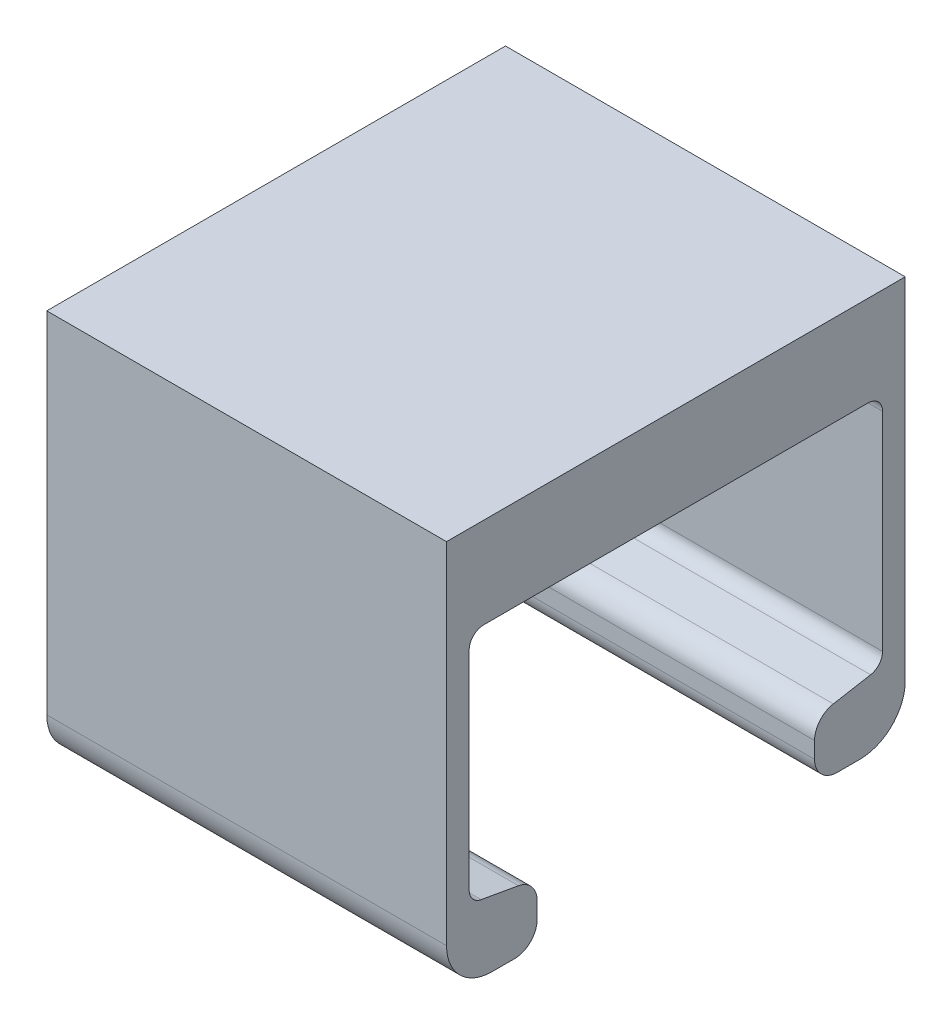
ISO-10303-21;
HEADER;
FILE_DESCRIPTION(('STEP AP214'),'2;1');
FILE_NAME('part.step','',(''),(''),'','','');
FILE_SCHEMA(('AUTOMOTIVE_DESIGN { 1 0 10303 214 1 1 1 1 }'));
ENDSEC;
DATA;
#1=APPLICATION_CONTEXT('core data for automotive mechanical design processes');
#2=APPLICATION_PROTOCOL_DEFINITION('international standard','automotive_design',2000,#1);
#3=PRODUCT_CONTEXT('',#1,'mechanical');
#4=PRODUCT('Part','Part','',(#3));
#5=PRODUCT_RELATED_PRODUCT_CATEGORY('part','',(#4));
#6=PRODUCT_DEFINITION_FORMATION('','',#4);
#7=PRODUCT_DEFINITION_CONTEXT('part definition',#1,'design');
#8=PRODUCT_DEFINITION('design','',#6,#7);
#9=PRODUCT_DEFINITION_SHAPE('','',#8);
#10=(LENGTH_UNIT() NAMED_UNIT(*) SI_UNIT(.MILLI.,.METRE.));
#11=(NAMED_UNIT(*) PLANE_ANGLE_UNIT() SI_UNIT($,.RADIAN.));
#12=(NAMED_UNIT(*) SI_UNIT($,.STERADIAN.) SOLID_ANGLE_UNIT());
#13=UNCERTAINTY_MEASURE_WITH_UNIT(LENGTH_MEASURE(1.E-05),#10,'distance_accuracy_value','');
#14=(GEOMETRIC_REPRESENTATION_CONTEXT(3) GLOBAL_UNCERTAINTY_ASSIGNED_CONTEXT((#13)) GLOBAL_UNIT_ASSIGNED_CONTEXT((#10,
#11,#12)) REPRESENTATION_CONTEXT('',''));
#15=CARTESIAN_POINT('',(0.,0.,0.));
#16=DIRECTION('',(0.,0.,1.));
#17=DIRECTION('',(1.,0.,0.));
#18=AXIS2_PLACEMENT_3D('',#15,#16,#17);
#19=CARTESIAN_POINT('',(14.,-6.26381577100157,-9.7155));
#20=DIRECTION('',(0.,-0.984807753012208,-0.173648177666931));
#21=DIRECTION('',(0.,0.173648177666931,-0.984807753012208));
#22=AXIS2_PLACEMENT_3D('',#19,#20,#21);
#23=PLANE('',#22);
#24=DIRECTION('',(0.,-0.173648177666931,0.984807753012208));
#25=VECTOR('',#24,1.);
#26=CARTESIAN_POINT('',(-14.,-6.26381577100157,-9.7155));
#27=LINE('',#26,#25);
#28=CARTESIAN_POINT('',(-14.,-5.57209797716179,-13.6384265485096));
#29=VERTEX_POINT('',#28);
#30=CARTESIAN_POINT('',(-14.,-6.03250412758862,-11.0273335179537));
#31=VERTEX_POINT('',#30);
#32=EDGE_CURVE('E389',#29,#31,#27,.T.);
#33=ORIENTED_EDGE('',*,*,#32,.T.);
#34=DIRECTION('',(-1.,0.,0.));
#35=VECTOR('',#34,1.);
#36=CARTESIAN_POINT('',(14.,-6.03250412758862,-11.0273335179537));
#37=LINE('',#36,#35);
#38=CARTESIAN_POINT('',(14.,-6.03250412758862,-11.0273335179537));
#39=VERTEX_POINT('',#38);
#40=EDGE_CURVE('E11',#31,#39,#37,.F.);
#41=ORIENTED_EDGE('',*,*,#40,.T.);
#42=DIRECTION('',(0.,-0.173648177666931,0.984807753012208));
#43=VECTOR('',#42,1.);
#44=CARTESIAN_POINT('',(14.,-6.26381577100157,-9.7155));
#45=LINE('',#44,#43);
#46=CARTESIAN_POINT('',(14.,-5.57209797716179,-13.6384265485096));
#47=VERTEX_POINT('',#46);
#48=EDGE_CURVE('E234',#47,#39,#45,.T.);
#49=ORIENTED_EDGE('',*,*,#48,.F.);
#50=DIRECTION('',(-1.,0.,0.));
#51=VECTOR('',#50,1.);
#52=CARTESIAN_POINT('',(-14.,-5.57209797716179,-13.6384265485096));
#53=LINE('',#52,#51);
#54=EDGE_CURVE('E288',#47,#29,#53,.T.);
#55=ORIENTED_EDGE('',*,*,#54,.T.);
#56=EDGE_LOOP('',(#33,#41,#49,#55));
#57=FACE_BOUND('',#56,.T.);
#58=ADVANCED_FACE('F35',(#57),#23,.F.);
#59=CARTESIAN_POINT('',(14.,-6.26381577100157,-9.7155));
#60=DIRECTION('',(0.,0.,-1.));
#61=DIRECTION('',(-1.,0.,0.));
#62=AXIS2_PLACEMENT_3D('',#59,#60,#61);
#63=PLANE('',#62);
#64=DIRECTION('',(0.,-1.,0.));
#65=VECTOR('',#64,1.);
#66=CARTESIAN_POINT('',(-14.,-6.26381577100157,-9.7155));
#67=LINE('',#66,#65);
#68=CARTESIAN_POINT('',(-14.,-7.5958864354955,-9.7155));
#69=VERTEX_POINT('',#68);
#70=CARTESIAN_POINT('',(-14.,-8.73784842210571,-9.7155));
#71=VERTEX_POINT('',#70);
#72=EDGE_CURVE('E391',#69,#71,#67,.T.);
#73=ORIENTED_EDGE('',*,*,#72,.T.);
#74=DIRECTION('',(-1.,0.,0.));
#75=VECTOR('',#74,1.);
#76=CARTESIAN_POINT('',(14.,-8.73784842210571,-9.7155));
#77=LINE('',#76,#75);
#78=CARTESIAN_POINT('',(14.,-8.73784842210571,-9.7155));
#79=VERTEX_POINT('',#78);
#80=EDGE_CURVE('E332',#71,#79,#77,.F.);
#81=ORIENTED_EDGE('',*,*,#80,.T.);
#82=DIRECTION('',(0.,-1.,0.));
#83=VECTOR('',#82,1.);
#84=CARTESIAN_POINT('',(14.,-6.26381577100157,-9.7155));
#85=LINE('',#84,#83);
#86=CARTESIAN_POINT('',(14.,-7.5958864354955,-9.7155));
#87=VERTEX_POINT('',#86);
#88=EDGE_CURVE('E236',#87,#79,#85,.T.);
#89=ORIENTED_EDGE('',*,*,#88,.F.);
#90=DIRECTION('',(-1.,0.,0.));
#91=VECTOR('',#90,1.);
#92=CARTESIAN_POINT('',(14.,-7.5958864354955,-9.7155));
#93=LINE('',#92,#91);
#94=EDGE_CURVE('E329',#87,#69,#93,.T.);
#95=ORIENTED_EDGE('',*,*,#94,.T.);
#96=EDGE_LOOP('',(#73,#81,#89,#95));
#97=FACE_BOUND('',#96,.T.);
#98=ADVANCED_FACE('F413',(#97),#63,.F.);
#99=CARTESIAN_POINT('',(14.,-10.3253484221057,-16.0655));
#100=DIRECTION('',(0.,1.,0.));
#101=DIRECTION('',(0.,0.,1.));
#102=AXIS2_PLACEMENT_3D('',#99,#100,#101);
#103=PLANE('',#102);
#104=DIRECTION('',(0.,0.,-1.));
#105=VECTOR('',#104,1.);
#106=CARTESIAN_POINT('',(14.,-10.3253484221057,-16.0655));
#107=LINE('',#106,#105);
#108=CARTESIAN_POINT('',(14.,-10.3253484221057,-11.303));
#109=VERTEX_POINT('',#108);
#110=CARTESIAN_POINT('',(14.,-10.3253484221057,-12.8905));
#111=VERTEX_POINT('',#110);
#112=EDGE_CURVE('E239',#109,#111,#107,.T.);
#113=ORIENTED_EDGE('',*,*,#112,.F.);
#114=DIRECTION('',(-1.,0.,0.));
#115=VECTOR('',#114,1.);
#116=CARTESIAN_POINT('',(14.,-10.3253484221057,-11.303));
#117=LINE('',#116,#115);
#118=CARTESIAN_POINT('',(-14.,-10.3253484221057,-11.303));
#119=VERTEX_POINT('',#118);
#120=EDGE_CURVE('E318',#109,#119,#117,.T.);
#121=ORIENTED_EDGE('',*,*,#120,.T.);
#122=DIRECTION('',(0.,0.,-1.));
#123=VECTOR('',#122,1.);
#124=CARTESIAN_POINT('',(-14.,-10.3253484221057,-16.0655));
#125=LINE('',#124,#123);
#126=CARTESIAN_POINT('',(-14.,-10.3253484221057,-12.8905));
#127=VERTEX_POINT('',#126);
#128=EDGE_CURVE('E198',#119,#127,#125,.T.);
#129=ORIENTED_EDGE('',*,*,#128,.T.);
#130=DIRECTION('',(-1.,0.,0.));
#131=VECTOR('',#130,1.);
#132=CARTESIAN_POINT('',(14.,-10.3253484221057,-12.8905));
#133=LINE('',#132,#131);
#134=EDGE_CURVE('E277',#127,#111,#133,.F.);
#135=ORIENTED_EDGE('',*,*,#134,.T.);
#136=EDGE_LOOP('',(#113,#121,#129,#135));
#137=FACE_BOUND('',#136,.T.);
#138=ADVANCED_FACE('F402',(#137),#103,.F.);
#139=CARTESIAN_POINT('',(14.,17.358,-16.0655));
#140=DIRECTION('',(0.,0.,1.));
#141=DIRECTION('',(0.,-1.,0.));
#142=AXIS2_PLACEMENT_3D('',#139,#140,#141);
#143=PLANE('',#142);
#144=DIRECTION('',(0.,1.,0.));
#145=VECTOR('',#144,1.);
#146=CARTESIAN_POINT('',(14.,17.358,-16.0655));
#147=LINE('',#146,#145);
#148=CARTESIAN_POINT('',(14.,-7.15034842210571,-16.0655));
#149=VERTEX_POINT('',#148);
#150=CARTESIAN_POINT('',(14.,17.358,-16.0655));
#151=VERTEX_POINT('',#150);
#152=EDGE_CURVE('E241',#149,#151,#147,.T.);
#153=ORIENTED_EDGE('',*,*,#152,.F.);
#154=DIRECTION('',(-1.,0.,0.));
#155=VECTOR('',#154,1.);
#156=CARTESIAN_POINT('',(14.,-7.15034842210572,-16.0655));
#157=LINE('',#156,#155);
#158=CARTESIAN_POINT('',(-14.,-7.15034842210571,-16.0655));
#159=VERTEX_POINT('',#158);
#160=EDGE_CURVE('E193',#149,#159,#157,.T.);
#161=ORIENTED_EDGE('',*,*,#160,.T.);
#162=DIRECTION('',(0.,1.,0.));
#163=VECTOR('',#162,1.);
#164=CARTESIAN_POINT('',(-14.,17.358,-16.0655));
#165=LINE('',#164,#163);
#166=CARTESIAN_POINT('',(-14.,17.358,-16.0655));
#167=VERTEX_POINT('',#166);
#168=EDGE_CURVE('E186',#159,#167,#165,.T.);
#169=ORIENTED_EDGE('',*,*,#168,.T.);
#170=DIRECTION('',(-1.,0.,0.));
#171=VECTOR('',#170,1.);
#172=CARTESIAN_POINT('',(14.,17.358,-16.0655));
#173=LINE('',#172,#171);
#174=EDGE_CURVE('E190',#151,#167,#173,.T.);
#175=ORIENTED_EDGE('',*,*,#174,.F.);
#176=EDGE_LOOP('',(#153,#161,#169,#175));
#177=FACE_BOUND('',#176,.T.);
#178=ADVANCED_FACE('F189',(#177),#143,.F.);
#179=CARTESIAN_POINT('',(14.,17.358,0.));
#180=DIRECTION('',(0.,-1.,0.));
#181=DIRECTION('',(0.,0.,-1.));
#182=AXIS2_PLACEMENT_3D('',#179,#180,#181);
#183=PLANE('',#182);
#184=ORIENTED_EDGE('',*,*,#174,.T.);
#185=DIRECTION('',(0.,0.,1.));
#186=VECTOR('',#185,1.);
#187=CARTESIAN_POINT('',(-14.,17.358,0.));
#188=LINE('',#187,#186);
#189=CARTESIAN_POINT('',(-14.,17.358,16.0655));
#190=VERTEX_POINT('',#189);
#191=EDGE_CURVE('E197',#167,#190,#188,.T.);
#192=ORIENTED_EDGE('',*,*,#191,.T.);
#193=DIRECTION('',(-1.,0.,0.));
#194=VECTOR('',#193,1.);
#195=CARTESIAN_POINT('',(14.,17.358,16.0655));
#196=LINE('',#195,#194);
#197=CARTESIAN_POINT('',(14.,17.358,16.0655));
#198=VERTEX_POINT('',#197);
#199=EDGE_CURVE('E207',#198,#190,#196,.T.);
#200=ORIENTED_EDGE('',*,*,#199,.F.);
#201=DIRECTION('',(0.,0.,1.));
#202=VECTOR('',#201,1.);
#203=CARTESIAN_POINT('',(14.,17.358,0.));
#204=LINE('',#203,#202);
#205=EDGE_CURVE('E205',#151,#198,#204,.T.);
#206=ORIENTED_EDGE('',*,*,#205,.F.);
#207=EDGE_LOOP('',(#184,#192,#200,#206));
#208=FACE_BOUND('',#207,.T.);
#209=ADVANCED_FACE('F202',(#208),#183,.F.);
#210=CARTESIAN_POINT('',(14.,17.358,16.0655));
#211=DIRECTION('',(0.,0.,-1.));
#212=DIRECTION('',(0.,1.,0.));
#213=AXIS2_PLACEMENT_3D('',#210,#211,#212);
#214=PLANE('',#213);
#215=DIRECTION('',(0.,-1.,0.));
#216=VECTOR('',#215,1.);
#217=CARTESIAN_POINT('',(-14.,17.358,16.0655));
#218=LINE('',#217,#216);
#219=CARTESIAN_POINT('',(-14.,-7.15034842210571,16.0655));
#220=VERTEX_POINT('',#219);
#221=EDGE_CURVE('E212',#190,#220,#218,.T.);
#222=ORIENTED_EDGE('',*,*,#221,.T.);
#223=DIRECTION('',(-1.,0.,0.));
#224=VECTOR('',#223,1.);
#225=CARTESIAN_POINT('',(14.,-7.15034842210572,16.0655));
#226=LINE('',#225,#224);
#227=CARTESIAN_POINT('',(14.,-7.15034842210571,16.0655));
#228=VERTEX_POINT('',#227);
#229=EDGE_CURVE('E270',#220,#228,#226,.F.);
#230=ORIENTED_EDGE('',*,*,#229,.T.);
#231=DIRECTION('',(0.,-1.,0.));
#232=VECTOR('',#231,1.);
#233=CARTESIAN_POINT('',(14.,17.358,16.0655));
#234=LINE('',#233,#232);
#235=EDGE_CURVE('E244',#198,#228,#234,.T.);
#236=ORIENTED_EDGE('',*,*,#235,.F.);
#237=ORIENTED_EDGE('',*,*,#199,.T.);
#238=EDGE_LOOP('',(#222,#230,#236,#237));
#239=FACE_BOUND('',#238,.T.);
#240=ADVANCED_FACE('F471',(#239),#214,.F.);
#241=CARTESIAN_POINT('',(14.,-10.3253484221057,16.0655));
#242=DIRECTION('',(0.,1.,0.));
#243=DIRECTION('',(0.,0.,1.));
#244=AXIS2_PLACEMENT_3D('',#241,#242,#243);
#245=PLANE('',#244);
#246=DIRECTION('',(0.,0.,-1.));
#247=VECTOR('',#246,1.);
#248=CARTESIAN_POINT('',(-14.,-10.3253484221057,16.0655));
#249=LINE('',#248,#247);
#250=CARTESIAN_POINT('',(-14.,-10.3253484221057,12.8905));
#251=VERTEX_POINT('',#250);
#252=CARTESIAN_POINT('',(-14.,-10.3253484221057,11.303));
#253=VERTEX_POINT('',#252);
#254=EDGE_CURVE('E214',#251,#253,#249,.T.);
#255=ORIENTED_EDGE('',*,*,#254,.T.);
#256=DIRECTION('',(-1.,0.,0.));
#257=VECTOR('',#256,1.);
#258=CARTESIAN_POINT('',(14.,-10.3253484221057,11.303));
#259=LINE('',#258,#257);
#260=CARTESIAN_POINT('',(14.,-10.3253484221057,11.303));
#261=VERTEX_POINT('',#260);
#262=EDGE_CURVE('E346',#253,#261,#259,.F.);
#263=ORIENTED_EDGE('',*,*,#262,.T.);
#264=DIRECTION('',(0.,0.,-1.));
#265=VECTOR('',#264,1.);
#266=CARTESIAN_POINT('',(14.,-10.3253484221057,16.0655));
#267=LINE('',#266,#265);
#268=CARTESIAN_POINT('',(14.,-10.3253484221057,12.8905));
#269=VERTEX_POINT('',#268);
#270=EDGE_CURVE('E247',#269,#261,#267,.T.);
#271=ORIENTED_EDGE('',*,*,#270,.F.);
#272=DIRECTION('',(-1.,0.,0.));
#273=VECTOR('',#272,1.);
#274=CARTESIAN_POINT('',(14.,-10.3253484221057,12.8905));
#275=LINE('',#274,#273);
#276=EDGE_CURVE('E206',#269,#251,#275,.T.);
#277=ORIENTED_EDGE('',*,*,#276,.T.);
#278=EDGE_LOOP('',(#255,#263,#271,#277));
#279=FACE_BOUND('',#278,.T.);
#280=ADVANCED_FACE('F466',(#279),#245,.F.);
#281=CARTESIAN_POINT('',(14.,-6.26381577100157,9.7155));
#282=DIRECTION('',(0.,0.,1.));
#283=DIRECTION('',(1.,0.,0.));
#284=AXIS2_PLACEMENT_3D('',#281,#282,#283);
#285=PLANE('',#284);
#286=DIRECTION('',(0.,1.,0.));
#287=VECTOR('',#286,1.);
#288=CARTESIAN_POINT('',(14.,-6.26381577100157,9.7155));
#289=LINE('',#288,#287);
#290=CARTESIAN_POINT('',(14.,-8.73784842210571,9.7155));
#291=VERTEX_POINT('',#290);
#292=CARTESIAN_POINT('',(14.,-7.5958864354955,9.7155));
#293=VERTEX_POINT('',#292);
#294=EDGE_CURVE('E250',#291,#293,#289,.T.);
#295=ORIENTED_EDGE('',*,*,#294,.F.);
#296=DIRECTION('',(-1.,0.,0.));
#297=VECTOR('',#296,1.);
#298=CARTESIAN_POINT('',(14.,-8.73784842210571,9.7155));
#299=LINE('',#298,#297);
#300=CARTESIAN_POINT('',(-14.,-8.73784842210571,9.7155));
#301=VERTEX_POINT('',#300);
#302=EDGE_CURVE('E343',#291,#301,#299,.T.);
#303=ORIENTED_EDGE('',*,*,#302,.T.);
#304=DIRECTION('',(0.,1.,0.));
#305=VECTOR('',#304,1.);
#306=CARTESIAN_POINT('',(-14.,-6.26381577100157,9.7155));
#307=LINE('',#306,#305);
#308=CARTESIAN_POINT('',(-14.,-7.5958864354955,9.7155));
#309=VERTEX_POINT('',#308);
#310=EDGE_CURVE('E220',#301,#309,#307,.T.);
#311=ORIENTED_EDGE('',*,*,#310,.T.);
#312=DIRECTION('',(-1.,0.,0.));
#313=VECTOR('',#312,1.);
#314=CARTESIAN_POINT('',(14.,-7.5958864354955,9.7155));
#315=LINE('',#314,#313);
#316=EDGE_CURVE('E341',#309,#293,#315,.F.);
#317=ORIENTED_EDGE('',*,*,#316,.T.);
#318=EDGE_LOOP('',(#295,#303,#311,#317));
#319=FACE_BOUND('',#318,.T.);
#320=ADVANCED_FACE('F462',(#319),#285,.F.);
#321=CARTESIAN_POINT('',(14.,-6.26381577100157,9.7155));
#322=DIRECTION('',(0.,-0.984807753012208,0.17364817766693));
#323=DIRECTION('',(0.,-0.17364817766693,-0.984807753012208));
#324=AXIS2_PLACEMENT_3D('',#321,#322,#323);
#325=PLANE('',#324);
#326=DIRECTION('',(0.,0.17364817766693,0.984807753012208));
#327=VECTOR('',#326,1.);
#328=CARTESIAN_POINT('',(14.,-6.26381577100157,9.7155));
#329=LINE('',#328,#327);
#330=CARTESIAN_POINT('',(14.,-6.03250412758862,11.0273335179537));
#331=VERTEX_POINT('',#330);
#332=CARTESIAN_POINT('',(14.,-5.57209797716179,13.6384265485096));
#333=VERTEX_POINT('',#332);
#334=EDGE_CURVE('E252',#331,#333,#329,.T.);
#335=ORIENTED_EDGE('',*,*,#334,.F.);
#336=DIRECTION('',(-1.,0.,0.));
#337=VECTOR('',#336,1.);
#338=CARTESIAN_POINT('',(14.,-6.03250412758862,11.0273335179537));
#339=LINE('',#338,#337);
#340=CARTESIAN_POINT('',(-14.,-6.03250412758862,11.0273335179537));
#341=VERTEX_POINT('',#340);
#342=EDGE_CURVE('E43',#331,#341,#339,.T.);
#343=ORIENTED_EDGE('',*,*,#342,.T.);
#344=DIRECTION('',(0.,0.17364817766693,0.984807753012208));
#345=VECTOR('',#344,1.);
#346=CARTESIAN_POINT('',(-14.,-6.26381577100157,9.7155));
#347=LINE('',#346,#345);
#348=CARTESIAN_POINT('',(-14.,-5.57209797716179,13.6384265485096));
#349=VERTEX_POINT('',#348);
#350=EDGE_CURVE('E223',#341,#349,#347,.T.);
#351=ORIENTED_EDGE('',*,*,#350,.T.);
#352=DIRECTION('',(-1.,0.,0.));
#353=VECTOR('',#352,1.);
#354=CARTESIAN_POINT('',(14.,-5.57209797716179,13.6384265485096));
#355=LINE('',#354,#353);
#356=EDGE_CURVE('E285',#349,#333,#355,.F.);
#357=ORIENTED_EDGE('',*,*,#356,.T.);
#358=EDGE_LOOP('',(#335,#343,#351,#357));
#359=FACE_BOUND('',#358,.T.);
#360=ADVANCED_FACE('F351',(#359),#325,.F.);
#361=CARTESIAN_POINT('',(14.,-5.4240585253775,14.478));
#362=DIRECTION('',(0.,0.,1.));
#363=DIRECTION('',(0.,-1.,0.));
#364=AXIS2_PLACEMENT_3D('',#361,#362,#363);
#365=PLANE('',#364);
#366=DIRECTION('',(0.,1.,0.));
#367=VECTOR('',#366,1.);
#368=CARTESIAN_POINT('',(14.,-5.4240585253775,14.478));
#369=LINE('',#368,#367);
#370=CARTESIAN_POINT('',(14.,-4.57153330010139,14.478));
#371=VERTEX_POINT('',#370);
#372=CARTESIAN_POINT('',(14.,9.992,14.478));
#373=VERTEX_POINT('',#372);
#374=EDGE_CURVE('E254',#371,#373,#369,.T.);
#375=ORIENTED_EDGE('',*,*,#374,.F.);
#376=DIRECTION('',(-1.,0.,0.));
#377=VECTOR('',#376,1.);
#378=CARTESIAN_POINT('',(-14.,-4.57153330010139,14.478));
#379=LINE('',#378,#377);
#380=CARTESIAN_POINT('',(-14.,-4.57153330010139,14.478));
#381=VERTEX_POINT('',#380);
#382=EDGE_CURVE('E282',#371,#381,#379,.T.);
#383=ORIENTED_EDGE('',*,*,#382,.T.);
#384=DIRECTION('',(0.,1.,0.));
#385=VECTOR('',#384,1.);
#386=CARTESIAN_POINT('',(-14.,-5.4240585253775,14.478));
#387=LINE('',#386,#385);
#388=CARTESIAN_POINT('',(-14.,9.992,14.478));
#389=VERTEX_POINT('',#388);
#390=EDGE_CURVE('E225',#381,#389,#387,.T.);
#391=ORIENTED_EDGE('',*,*,#390,.T.);
#392=DIRECTION('',(-1.,0.,0.));
#393=VECTOR('',#392,1.);
#394=CARTESIAN_POINT('',(14.,9.992,14.478));
#395=LINE('',#394,#393);
#396=EDGE_CURVE('E280',#389,#373,#395,.F.);
#397=ORIENTED_EDGE('',*,*,#396,.T.);
#398=EDGE_LOOP('',(#375,#383,#391,#397));
#399=FACE_BOUND('',#398,.T.);
#400=ADVANCED_FACE('F364',(#399),#365,.F.);
#401=CARTESIAN_POINT('',(14.,11.008,0.));
#402=DIRECTION('',(0.,1.,0.));
#403=DIRECTION('',(0.,0.,1.));
#404=AXIS2_PLACEMENT_3D('',#401,#402,#403);
#405=PLANE('',#404);
#406=CARTESIAN_POINT('',(0.,11.008,0.));
#407=DIRECTION('',(0.,-1.,0.));
#408=DIRECTION('',(0.,0.,-1.));
#409=AXIS2_PLACEMENT_3D('',#406,#407,#408);
#410=CIRCLE('',#409,9.0297);
#411=CARTESIAN_POINT('',(0.,11.008,-9.02969999999999));
#412=VERTEX_POINT('',#411);
#413=EDGE_CURVE('E397',#412,#412,#410,.T.);
#414=ORIENTED_EDGE('',*,*,#413,.F.);
#415=EDGE_LOOP('',(#414));
#416=FACE_BOUND('',#415,.T.);
#417=DIRECTION('',(0.,0.,-1.));
#418=VECTOR('',#417,1.);
#419=CARTESIAN_POINT('',(14.,11.008,0.));
#420=LINE('',#419,#418);
#421=CARTESIAN_POINT('',(14.,11.008,13.462));
#422=VERTEX_POINT('',#421);
#423=CARTESIAN_POINT('',(14.,11.008,-13.462));
#424=VERTEX_POINT('',#423);
#425=EDGE_CURVE('E257',#422,#424,#420,.T.);
#426=ORIENTED_EDGE('',*,*,#425,.F.);
#427=DIRECTION('',(-1.,0.,0.));
#428=VECTOR('',#427,1.);
#429=CARTESIAN_POINT('',(-14.,11.008,13.462));
#430=LINE('',#429,#428);
#431=CARTESIAN_POINT('',(-14.,11.008,13.462));
#432=VERTEX_POINT('',#431);
#433=EDGE_CURVE('E298',#422,#432,#430,.T.);
#434=ORIENTED_EDGE('',*,*,#433,.T.);
#435=DIRECTION('',(0.,0.,-1.));
#436=VECTOR('',#435,1.);
#437=CARTESIAN_POINT('',(-14.,11.008,0.));
#438=LINE('',#437,#436);
#439=CARTESIAN_POINT('',(-14.,11.008,-13.462));
#440=VERTEX_POINT('',#439);
#441=EDGE_CURVE('E228',#432,#440,#438,.T.);
#442=ORIENTED_EDGE('',*,*,#441,.T.);
#443=DIRECTION('',(-1.,0.,0.));
#444=VECTOR('',#443,1.);
#445=CARTESIAN_POINT('',(14.,11.008,-13.462));
#446=LINE('',#445,#444);
#447=EDGE_CURVE('E296',#440,#424,#446,.F.);
#448=ORIENTED_EDGE('',*,*,#447,.T.);
#449=EDGE_LOOP('',(#426,#434,#442,#448));
#450=FACE_BOUND('',#449,.T.);
#451=ADVANCED_FACE('F372',(#416,#450),#405,.F.);
#452=CARTESIAN_POINT('',(14.,-5.4240585253775,-14.478));
#453=DIRECTION('',(0.,0.,-1.));
#454=DIRECTION('',(0.,1.,0.));
#455=AXIS2_PLACEMENT_3D('',#452,#453,#454);
#456=PLANE('',#455);
#457=DIRECTION('',(0.,-1.,0.));
#458=VECTOR('',#457,1.);
#459=CARTESIAN_POINT('',(-14.,-5.4240585253775,-14.478));
#460=LINE('',#459,#458);
#461=CARTESIAN_POINT('',(-14.,9.992,-14.478));
#462=VERTEX_POINT('',#461);
#463=CARTESIAN_POINT('',(-14.,-4.57153330010139,-14.478));
#464=VERTEX_POINT('',#463);
#465=EDGE_CURVE('E231',#462,#464,#460,.T.);
#466=ORIENTED_EDGE('',*,*,#465,.T.);
#467=DIRECTION('',(-1.,0.,0.));
#468=VECTOR('',#467,1.);
#469=CARTESIAN_POINT('',(14.,-4.57153330010139,-14.478));
#470=LINE('',#469,#468);
#471=CARTESIAN_POINT('',(14.,-4.57153330010139,-14.478));
#472=VERTEX_POINT('',#471);
#473=EDGE_CURVE('E294',#464,#472,#470,.F.);
#474=ORIENTED_EDGE('',*,*,#473,.T.);
#475=DIRECTION('',(0.,-1.,0.));
#476=VECTOR('',#475,1.);
#477=CARTESIAN_POINT('',(14.,-5.4240585253775,-14.478));
#478=LINE('',#477,#476);
#479=CARTESIAN_POINT('',(14.,9.992,-14.478));
#480=VERTEX_POINT('',#479);
#481=EDGE_CURVE('E260',#480,#472,#478,.T.);
#482=ORIENTED_EDGE('',*,*,#481,.F.);
#483=DIRECTION('',(-1.,0.,0.));
#484=VECTOR('',#483,1.);
#485=CARTESIAN_POINT('',(-14.,9.992,-14.478));
#486=LINE('',#485,#484);
#487=EDGE_CURVE('E291',#480,#462,#486,.T.);
#488=ORIENTED_EDGE('',*,*,#487,.T.);
#489=EDGE_LOOP('',(#466,#474,#482,#488));
#490=FACE_BOUND('',#489,.T.);
#491=ADVANCED_FACE('F381',(#490),#456,.F.);
#492=CARTESIAN_POINT('',(14.,0.,0.));
#493=DIRECTION('',(1.,0.,0.));
#494=DIRECTION('',(0.,0.,-1.));
#495=AXIS2_PLACEMENT_3D('',#492,#493,#494);
#496=PLANE('',#495);
#497=ORIENTED_EDGE('',*,*,#88,.T.);
#498=CARTESIAN_POINT('',(14.,-8.73784842210571,-11.303));
#499=DIRECTION('',(1.,0.,0.));
#500=DIRECTION('',(0.,0.,-1.));
#501=AXIS2_PLACEMENT_3D('',#498,#499,#500);
#502=CIRCLE('',#501,1.5875);
#503=EDGE_CURVE('E339',#79,#109,#502,.T.);
#504=ORIENTED_EDGE('',*,*,#503,.T.);
#505=ORIENTED_EDGE('',*,*,#112,.T.);
#506=CARTESIAN_POINT('',(14.,-7.15034842210572,-12.8905));
#507=DIRECTION('',(1.,0.,0.));
#508=DIRECTION('',(0.,0.,-1.));
#509=AXIS2_PLACEMENT_3D('',#506,#507,#508);
#510=CIRCLE('',#509,3.175);
#511=EDGE_CURVE('E272',#111,#149,#510,.T.);
#512=ORIENTED_EDGE('',*,*,#511,.T.);
#513=ORIENTED_EDGE('',*,*,#152,.T.);
#514=ORIENTED_EDGE('',*,*,#205,.T.);
#515=ORIENTED_EDGE('',*,*,#235,.T.);
#516=CARTESIAN_POINT('',(14.,-7.15034842210572,12.8905));
#517=DIRECTION('',(1.,0.,0.));
#518=DIRECTION('',(0.,0.,-1.));
#519=AXIS2_PLACEMENT_3D('',#516,#517,#518);
#520=CIRCLE('',#519,3.175);
#521=EDGE_CURVE('E274',#228,#269,#520,.T.);
#522=ORIENTED_EDGE('',*,*,#521,.T.);
#523=ORIENTED_EDGE('',*,*,#270,.T.);
#524=CARTESIAN_POINT('',(14.,-8.73784842210571,11.303));
#525=DIRECTION('',(1.,0.,0.));
#526=DIRECTION('',(0.,0.,-1.));
#527=AXIS2_PLACEMENT_3D('',#524,#525,#526);
#528=CIRCLE('',#527,1.5875);
#529=EDGE_CURVE('E337',#261,#291,#528,.T.);
#530=ORIENTED_EDGE('',*,*,#529,.T.);
#531=ORIENTED_EDGE('',*,*,#294,.T.);
#532=CARTESIAN_POINT('',(14.,-7.5958864354955,11.303));
#533=DIRECTION('',(1.,0.,0.));
#534=DIRECTION('',(0.,0.,-1.));
#535=AXIS2_PLACEMENT_3D('',#532,#533,#534);
#536=CIRCLE('',#535,1.5875);
#537=EDGE_CURVE('E56',#293,#331,#536,.T.);
#538=ORIENTED_EDGE('',*,*,#537,.T.);
#539=ORIENTED_EDGE('',*,*,#334,.T.);
#540=CARTESIAN_POINT('',(14.,-4.57153330010139,13.462));
#541=DIRECTION('',(1.,0.,0.));
#542=DIRECTION('',(0.,0.,-1.));
#543=AXIS2_PLACEMENT_3D('',#540,#541,#542);
#544=CIRCLE('',#543,1.016);
#545=EDGE_CURVE('E304',#333,#371,#544,.F.);
#546=ORIENTED_EDGE('',*,*,#545,.T.);
#547=ORIENTED_EDGE('',*,*,#374,.T.);
#548=CARTESIAN_POINT('',(14.,9.992,13.462));
#549=DIRECTION('',(1.,0.,0.));
#550=DIRECTION('',(0.,0.,-1.));
#551=AXIS2_PLACEMENT_3D('',#548,#549,#550);
#552=CIRCLE('',#551,1.016);
#553=EDGE_CURVE('E312',#373,#422,#552,.F.);
#554=ORIENTED_EDGE('',*,*,#553,.T.);
#555=ORIENTED_EDGE('',*,*,#425,.T.);
#556=CARTESIAN_POINT('',(14.,9.992,-13.462));
#557=DIRECTION('',(1.,0.,0.));
#558=DIRECTION('',(0.,0.,-1.));
#559=AXIS2_PLACEMENT_3D('',#556,#557,#558);
#560=CIRCLE('',#559,1.016);
#561=EDGE_CURVE('E316',#424,#480,#560,.F.);
#562=ORIENTED_EDGE('',*,*,#561,.T.);
#563=ORIENTED_EDGE('',*,*,#481,.T.);
#564=CARTESIAN_POINT('',(14.,-4.57153330010139,-13.462));
#565=DIRECTION('',(1.,0.,0.));
#566=DIRECTION('',(0.,0.,-1.));
#567=AXIS2_PLACEMENT_3D('',#564,#565,#566);
#568=CIRCLE('',#567,1.016);
#569=EDGE_CURVE('E308',#472,#47,#568,.F.);
#570=ORIENTED_EDGE('',*,*,#569,.T.);
#571=ORIENTED_EDGE('',*,*,#48,.T.);
#572=CARTESIAN_POINT('',(14.,-7.5958864354955,-11.303));
#573=DIRECTION('',(1.,0.,0.));
#574=DIRECTION('',(0.,0.,-1.));
#575=AXIS2_PLACEMENT_3D('',#572,#573,#574);
#576=CIRCLE('',#575,1.5875);
#577=EDGE_CURVE('E334',#39,#87,#576,.T.);
#578=ORIENTED_EDGE('',*,*,#577,.T.);
#579=EDGE_LOOP('',(#497,#504,#505,#512,#513,#514,#515,#522,#523,#530,#531,#538,#539,#546,#547,
#554,#555,#562,#563,#570,#571,#578));
#580=FACE_BOUND('',#579,.T.);
#581=ADVANCED_FACE('F361',(#580),#496,.T.);
#582=CARTESIAN_POINT('',(-14.,0.,0.));
#583=DIRECTION('',(1.,0.,0.));
#584=DIRECTION('',(0.,0.,-1.));
#585=AXIS2_PLACEMENT_3D('',#582,#583,#584);
#586=PLANE('',#585);
#587=ORIENTED_EDGE('',*,*,#128,.F.);
#588=CARTESIAN_POINT('',(-14.,-8.73784842210571,-11.303));
#589=DIRECTION('',(1.,0.,0.));
#590=DIRECTION('',(0.,0.,-1.));
#591=AXIS2_PLACEMENT_3D('',#588,#589,#590);
#592=CIRCLE('',#591,1.5875);
#593=EDGE_CURVE('E327',#119,#71,#592,.F.);
#594=ORIENTED_EDGE('',*,*,#593,.T.);
#595=ORIENTED_EDGE('',*,*,#72,.F.);
#596=CARTESIAN_POINT('',(-14.,-7.5958864354955,-11.303));
#597=DIRECTION('',(1.,0.,0.));
#598=DIRECTION('',(0.,0.,-1.));
#599=AXIS2_PLACEMENT_3D('',#596,#597,#598);
#600=CIRCLE('',#599,1.5875);
#601=EDGE_CURVE('E321',#69,#31,#600,.F.);
#602=ORIENTED_EDGE('',*,*,#601,.T.);
#603=ORIENTED_EDGE('',*,*,#32,.F.);
#604=CARTESIAN_POINT('',(-14.,-4.57153330010139,-13.462));
#605=DIRECTION('',(1.,0.,0.));
#606=DIRECTION('',(0.,0.,-1.));
#607=AXIS2_PLACEMENT_3D('',#604,#605,#606);
#608=CIRCLE('',#607,1.016);
#609=EDGE_CURVE('E306',#29,#464,#608,.T.);
#610=ORIENTED_EDGE('',*,*,#609,.T.);
#611=ORIENTED_EDGE('',*,*,#465,.F.);
#612=CARTESIAN_POINT('',(-14.,9.992,-13.462));
#613=DIRECTION('',(1.,0.,0.));
#614=DIRECTION('',(0.,0.,-1.));
#615=AXIS2_PLACEMENT_3D('',#612,#613,#614);
#616=CIRCLE('',#615,1.016);
#617=EDGE_CURVE('E314',#462,#440,#616,.T.);
#618=ORIENTED_EDGE('',*,*,#617,.T.);
#619=ORIENTED_EDGE('',*,*,#441,.F.);
#620=CARTESIAN_POINT('',(-14.,9.992,13.462));
#621=DIRECTION('',(1.,0.,0.));
#622=DIRECTION('',(0.,0.,-1.));
#623=AXIS2_PLACEMENT_3D('',#620,#621,#622);
#624=CIRCLE('',#623,1.016);
#625=EDGE_CURVE('E310',#432,#389,#624,.T.);
#626=ORIENTED_EDGE('',*,*,#625,.T.);
#627=ORIENTED_EDGE('',*,*,#390,.F.);
#628=CARTESIAN_POINT('',(-14.,-4.57153330010139,13.462));
#629=DIRECTION('',(1.,0.,0.));
#630=DIRECTION('',(0.,0.,-1.));
#631=AXIS2_PLACEMENT_3D('',#628,#629,#630);
#632=CIRCLE('',#631,1.016);
#633=EDGE_CURVE('E301',#381,#349,#632,.T.);
#634=ORIENTED_EDGE('',*,*,#633,.T.);
#635=ORIENTED_EDGE('',*,*,#350,.F.);
#636=CARTESIAN_POINT('',(-14.,-7.5958864354955,11.303));
#637=DIRECTION('',(1.,0.,0.));
#638=DIRECTION('',(0.,0.,-1.));
#639=AXIS2_PLACEMENT_3D('',#636,#637,#638);
#640=CIRCLE('',#639,1.5875);
#641=EDGE_CURVE('E323',#341,#309,#640,.F.);
#642=ORIENTED_EDGE('',*,*,#641,.T.);
#643=ORIENTED_EDGE('',*,*,#310,.F.);
#644=CARTESIAN_POINT('',(-14.,-8.73784842210571,11.303));
#645=DIRECTION('',(1.,0.,0.));
#646=DIRECTION('',(0.,0.,-1.));
#647=AXIS2_PLACEMENT_3D('',#644,#645,#646);
#648=CIRCLE('',#647,1.5875);
#649=EDGE_CURVE('E325',#301,#253,#648,.F.);
#650=ORIENTED_EDGE('',*,*,#649,.T.);
#651=ORIENTED_EDGE('',*,*,#254,.F.);
#652=CARTESIAN_POINT('',(-14.,-7.15034842210572,12.8905));
#653=DIRECTION('',(1.,0.,0.));
#654=DIRECTION('',(0.,0.,-1.));
#655=AXIS2_PLACEMENT_3D('',#652,#653,#654);
#656=CIRCLE('',#655,3.175);
#657=EDGE_CURVE('E268',#251,#220,#656,.F.);
#658=ORIENTED_EDGE('',*,*,#657,.T.);
#659=ORIENTED_EDGE('',*,*,#221,.F.);
#660=ORIENTED_EDGE('',*,*,#191,.F.);
#661=ORIENTED_EDGE('',*,*,#168,.F.);
#662=CARTESIAN_POINT('',(-14.,-7.15034842210572,-12.8905));
#663=DIRECTION('',(1.,0.,0.));
#664=DIRECTION('',(0.,0.,-1.));
#665=AXIS2_PLACEMENT_3D('',#662,#663,#664);
#666=CIRCLE('',#665,3.175);
#667=EDGE_CURVE('E266',#159,#127,#666,.F.);
#668=ORIENTED_EDGE('',*,*,#667,.T.);
#669=EDGE_LOOP('',(#587,#594,#595,#602,#603,#610,#611,#618,#619,#626,#627,#634,#635,#642,#643,
#650,#651,#658,#659,#660,#661,#668));
#670=FACE_BOUND('',#669,.T.);
#671=ADVANCED_FACE('F210',(#670),#586,.F.);
#672=CARTESIAN_POINT('',(14.,-7.15034842210572,12.8905));
#673=DIRECTION('',(-1.,0.,0.));
#674=DIRECTION('',(0.,0.,1.));
#675=AXIS2_PLACEMENT_3D('',#672,#673,#674);
#676=CYLINDRICAL_SURFACE('',#675,3.175);
#677=ORIENTED_EDGE('',*,*,#521,.F.);
#678=ORIENTED_EDGE('',*,*,#229,.F.);
#679=ORIENTED_EDGE('',*,*,#657,.F.);
#680=ORIENTED_EDGE('',*,*,#276,.F.);
#681=EDGE_LOOP('',(#677,#678,#679,#680));
#682=FACE_BOUND('',#681,.T.);
#683=ADVANCED_FACE('F436',(#682),#676,.T.);
#684=CARTESIAN_POINT('',(14.,-7.15034842210572,-12.8905));
#685=DIRECTION('',(-1.,0.,0.));
#686=DIRECTION('',(0.,0.,1.));
#687=AXIS2_PLACEMENT_3D('',#684,#685,#686);
#688=CYLINDRICAL_SURFACE('',#687,3.175);
#689=ORIENTED_EDGE('',*,*,#511,.F.);
#690=ORIENTED_EDGE('',*,*,#134,.F.);
#691=ORIENTED_EDGE('',*,*,#667,.F.);
#692=ORIENTED_EDGE('',*,*,#160,.F.);
#693=EDGE_LOOP('',(#689,#690,#691,#692));
#694=FACE_BOUND('',#693,.T.);
#695=ADVANCED_FACE('F407',(#694),#688,.T.);
#696=CARTESIAN_POINT('',(14.,-4.57153330010139,13.462));
#697=DIRECTION('',(1.,0.,0.));
#698=DIRECTION('',(0.,0.,-1.));
#699=AXIS2_PLACEMENT_3D('',#696,#697,#698);
#700=CYLINDRICAL_SURFACE('',#699,1.016);
#701=ORIENTED_EDGE('',*,*,#545,.F.);
#702=ORIENTED_EDGE('',*,*,#356,.F.);
#703=ORIENTED_EDGE('',*,*,#633,.F.);
#704=ORIENTED_EDGE('',*,*,#382,.F.);
#705=EDGE_LOOP('',(#701,#702,#703,#704));
#706=FACE_BOUND('',#705,.T.);
#707=ADVANCED_FACE('F359',(#706),#700,.F.);
#708=CARTESIAN_POINT('',(14.,-4.57153330010139,-13.462));
#709=DIRECTION('',(1.,0.,0.));
#710=DIRECTION('',(0.,0.,-1.));
#711=AXIS2_PLACEMENT_3D('',#708,#709,#710);
#712=CYLINDRICAL_SURFACE('',#711,1.016);
#713=ORIENTED_EDGE('',*,*,#569,.F.);
#714=ORIENTED_EDGE('',*,*,#473,.F.);
#715=ORIENTED_EDGE('',*,*,#609,.F.);
#716=ORIENTED_EDGE('',*,*,#54,.F.);
#717=EDGE_LOOP('',(#713,#714,#715,#716));
#718=FACE_BOUND('',#717,.T.);
#719=ADVANCED_FACE('F385',(#718),#712,.F.);
#720=CARTESIAN_POINT('',(14.,9.992,13.462));
#721=DIRECTION('',(1.,0.,0.));
#722=DIRECTION('',(0.,0.,-1.));
#723=AXIS2_PLACEMENT_3D('',#720,#721,#722);
#724=CYLINDRICAL_SURFACE('',#723,1.016);
#725=ORIENTED_EDGE('',*,*,#553,.F.);
#726=ORIENTED_EDGE('',*,*,#396,.F.);
#727=ORIENTED_EDGE('',*,*,#625,.F.);
#728=ORIENTED_EDGE('',*,*,#433,.F.);
#729=EDGE_LOOP('',(#725,#726,#727,#728));
#730=FACE_BOUND('',#729,.T.);
#731=ADVANCED_FACE('F367',(#730),#724,.F.);
#732=CARTESIAN_POINT('',(14.,9.992,-13.462));
#733=DIRECTION('',(1.,0.,0.));
#734=DIRECTION('',(0.,0.,-1.));
#735=AXIS2_PLACEMENT_3D('',#732,#733,#734);
#736=CYLINDRICAL_SURFACE('',#735,1.016);
#737=ORIENTED_EDGE('',*,*,#561,.F.);
#738=ORIENTED_EDGE('',*,*,#447,.F.);
#739=ORIENTED_EDGE('',*,*,#617,.F.);
#740=ORIENTED_EDGE('',*,*,#487,.F.);
#741=EDGE_LOOP('',(#737,#738,#739,#740));
#742=FACE_BOUND('',#741,.T.);
#743=ADVANCED_FACE('F376',(#742),#736,.F.);
#744=CARTESIAN_POINT('',(14.,-8.73784842210571,-11.303));
#745=DIRECTION('',(-1.,0.,0.));
#746=DIRECTION('',(0.,0.,1.));
#747=AXIS2_PLACEMENT_3D('',#744,#745,#746);
#748=CYLINDRICAL_SURFACE('',#747,1.5875);
#749=ORIENTED_EDGE('',*,*,#503,.F.);
#750=ORIENTED_EDGE('',*,*,#80,.F.);
#751=ORIENTED_EDGE('',*,*,#593,.F.);
#752=ORIENTED_EDGE('',*,*,#120,.F.);
#753=EDGE_LOOP('',(#749,#750,#751,#752));
#754=FACE_BOUND('',#753,.T.);
#755=ADVANCED_FACE('F410',(#754),#748,.T.);
#756=CARTESIAN_POINT('',(14.,-8.73784842210571,11.303));
#757=DIRECTION('',(-1.,0.,0.));
#758=DIRECTION('',(0.,0.,1.));
#759=AXIS2_PLACEMENT_3D('',#756,#757,#758);
#760=CYLINDRICAL_SURFACE('',#759,1.5875);
#761=ORIENTED_EDGE('',*,*,#529,.F.);
#762=ORIENTED_EDGE('',*,*,#262,.F.);
#763=ORIENTED_EDGE('',*,*,#649,.F.);
#764=ORIENTED_EDGE('',*,*,#302,.F.);
#765=EDGE_LOOP('',(#761,#762,#763,#764));
#766=FACE_BOUND('',#765,.T.);
#767=ADVANCED_FACE('F427',(#766),#760,.T.);
#768=CARTESIAN_POINT('',(14.,-7.5958864354955,11.303));
#769=DIRECTION('',(-1.,0.,0.));
#770=DIRECTION('',(0.,0.,1.));
#771=AXIS2_PLACEMENT_3D('',#768,#769,#770);
#772=CYLINDRICAL_SURFACE('',#771,1.5875);
#773=ORIENTED_EDGE('',*,*,#537,.F.);
#774=ORIENTED_EDGE('',*,*,#316,.F.);
#775=ORIENTED_EDGE('',*,*,#641,.F.);
#776=ORIENTED_EDGE('',*,*,#342,.F.);
#777=EDGE_LOOP('',(#773,#774,#775,#776));
#778=FACE_BOUND('',#777,.T.);
#779=ADVANCED_FACE('F419',(#778),#772,.T.);
#780=CARTESIAN_POINT('',(14.,-7.5958864354955,-11.303));
#781=DIRECTION('',(-1.,0.,0.));
#782=DIRECTION('',(0.,0.,1.));
#783=AXIS2_PLACEMENT_3D('',#780,#781,#782);
#784=CYLINDRICAL_SURFACE('',#783,1.5875);
#785=ORIENTED_EDGE('',*,*,#577,.F.);
#786=ORIENTED_EDGE('',*,*,#40,.F.);
#787=ORIENTED_EDGE('',*,*,#601,.F.);
#788=ORIENTED_EDGE('',*,*,#94,.F.);
#789=EDGE_LOOP('',(#785,#786,#787,#788));
#790=FACE_BOUND('',#789,.T.);
#791=ADVANCED_FACE('F37',(#790),#784,.T.);
#792=CARTESIAN_POINT('',(0.,14.056,0.));
#793=DIRECTION('',(0.,-1.,0.));
#794=DIRECTION('',(0.,0.,-1.));
#795=AXIS2_PLACEMENT_3D('',#792,#793,#794);
#796=CYLINDRICAL_SURFACE('',#795,9.0297);
#797=CARTESIAN_POINT('',(0.,14.056,0.));
#798=DIRECTION('',(0.,-1.,0.));
#799=DIRECTION('',(0.,0.,-1.));
#800=AXIS2_PLACEMENT_3D('',#797,#798,#799);
#801=CIRCLE('',#800,9.0297);
#802=CARTESIAN_POINT('',(0.,14.056,-9.02969999999999));
#803=VERTEX_POINT('',#802);
#804=EDGE_CURVE('E392',#803,#803,#801,.T.);
#805=CARTESIAN_POINT('',(0.,14.056,-9.02969999999999));
#806=CARTESIAN_POINT('',(0.,14.02425,-9.02969999999999));
#807=CARTESIAN_POINT('',(0.,13.9925,-9.02969999999999));
#808=CARTESIAN_POINT('',(0.,13.929,-9.02969999999999));
#809=CARTESIAN_POINT('',(0.,13.89725,-9.02969999999999));
#810=CARTESIAN_POINT('',(0.,13.83375,-9.02969999999999));
#811=CARTESIAN_POINT('',(0.,13.802,-9.02969999999999));
#812=CARTESIAN_POINT('',(0.,13.7385,-9.02969999999999));
#813=CARTESIAN_POINT('',(0.,13.70675,-9.02969999999999));
#814=CARTESIAN_POINT('',(0.,13.64325,-9.02969999999999));
#815=CARTESIAN_POINT('',(0.,13.6115,-9.02969999999999));
#816=CARTESIAN_POINT('',(0.,13.548,-9.02969999999999));
#817=CARTESIAN_POINT('',(0.,13.51625,-9.02969999999999));
#818=CARTESIAN_POINT('',(0.,13.45275,-9.02969999999999));
#819=CARTESIAN_POINT('',(0.,13.421,-9.02969999999999));
#820=CARTESIAN_POINT('',(0.,13.3575,-9.02969999999999));
#821=CARTESIAN_POINT('',(0.,13.32575,-9.02969999999999));
#822=CARTESIAN_POINT('',(0.,13.26225,-9.02969999999999));
#823=CARTESIAN_POINT('',(0.,13.2305,-9.02969999999999));
#824=CARTESIAN_POINT('',(0.,13.167,-9.02969999999999));
#825=CARTESIAN_POINT('',(0.,13.13525,-9.02969999999999));
#826=CARTESIAN_POINT('',(0.,13.07175,-9.02969999999999));
#827=CARTESIAN_POINT('',(0.,13.04,-9.02969999999999));
#828=CARTESIAN_POINT('',(0.,12.9765,-9.02969999999999));
#829=CARTESIAN_POINT('',(0.,12.94475,-9.02969999999999));
#830=CARTESIAN_POINT('',(0.,12.88125,-9.02969999999999));
#831=CARTESIAN_POINT('',(0.,12.8495,-9.02969999999999));
#832=CARTESIAN_POINT('',(0.,12.786,-9.02969999999999));
#833=CARTESIAN_POINT('',(0.,12.75425,-9.02969999999999));
#834=CARTESIAN_POINT('',(0.,12.69075,-9.02969999999999));
#835=CARTESIAN_POINT('',(0.,12.659,-9.02969999999999));
#836=CARTESIAN_POINT('',(0.,12.5955,-9.02969999999999));
#837=CARTESIAN_POINT('',(0.,12.56375,-9.02969999999999));
#838=CARTESIAN_POINT('',(0.,12.50025,-9.02969999999999));
#839=CARTESIAN_POINT('',(0.,12.4685,-9.02969999999999));
#840=CARTESIAN_POINT('',(0.,12.405,-9.02969999999999));
#841=CARTESIAN_POINT('',(0.,12.37325,-9.02969999999999));
#842=CARTESIAN_POINT('',(0.,12.30975,-9.02969999999999));
#843=CARTESIAN_POINT('',(0.,12.278,-9.02969999999999));
#844=CARTESIAN_POINT('',(0.,12.2145,-9.02969999999999));
#845=CARTESIAN_POINT('',(0.,12.18275,-9.02969999999999));
#846=CARTESIAN_POINT('',(0.,12.11925,-9.02969999999999));
#847=CARTESIAN_POINT('',(0.,12.0875,-9.02969999999999));
#848=CARTESIAN_POINT('',(0.,12.024,-9.02969999999999));
#849=CARTESIAN_POINT('',(0.,11.99225,-9.02969999999999));
#850=CARTESIAN_POINT('',(0.,11.92875,-9.02969999999999));
#851=CARTESIAN_POINT('',(0.,11.897,-9.02969999999999));
#852=CARTESIAN_POINT('',(0.,11.8335,-9.02969999999999));
#853=CARTESIAN_POINT('',(0.,11.80175,-9.02969999999999));
#854=CARTESIAN_POINT('',(0.,11.73825,-9.02969999999999));
#855=CARTESIAN_POINT('',(0.,11.7065,-9.02969999999999));
#856=CARTESIAN_POINT('',(0.,11.643,-9.02969999999999));
#857=CARTESIAN_POINT('',(0.,11.61125,-9.02969999999999));
#858=CARTESIAN_POINT('',(0.,11.54775,-9.02969999999999));
#859=CARTESIAN_POINT('',(0.,11.516,-9.02969999999999));
#860=CARTESIAN_POINT('',(0.,11.4525,-9.02969999999999));
#861=CARTESIAN_POINT('',(0.,11.42075,-9.02969999999999));
#862=CARTESIAN_POINT('',(0.,11.35725,-9.02969999999999));
#863=CARTESIAN_POINT('',(0.,11.3255,-9.02969999999999));
#864=CARTESIAN_POINT('',(0.,11.262,-9.02969999999999));
#865=CARTESIAN_POINT('',(0.,11.23025,-9.02969999999999));
#866=CARTESIAN_POINT('',(0.,11.16675,-9.02969999999999));
#867=CARTESIAN_POINT('',(0.,11.135,-9.02969999999999));
#868=CARTESIAN_POINT('',(0.,11.0715,-9.02969999999999));
#869=CARTESIAN_POINT('',(0.,11.03975,-9.02969999999999));
#870=CARTESIAN_POINT('',(0.,11.008,-9.02969999999999));
#871=B_SPLINE_CURVE_WITH_KNOTS('',3,(#805,#806,#807,#808,#809,#810,#811,#812,#813,#814,#815,
#816,#817,#818,#819,#820,#821,#822,#823,#824,#825,#826,#827,#828,#829,#830,#831,#832,#833,#834,
#835,#836,#837,#838,#839,#840,#841,#842,#843,#844,#845,#846,#847,#848,#849,#850,#851,#852,#853,
#854,#855,#856,#857,#858,#859,#860,#861,#862,#863,#864,#865,#866,#867,#868,#869,#870),
.UNSPECIFIED.,.F.,.F.,(4,2,2,2,2,2,2,2,2,2,2,2,2,2,2,2,2,2,2,2,2,2,2,2,2,2,2,2,2,2,2,2,4),(0.,
0.0952499999999998,0.1905,0.28575,0.380999999999999,0.476249999999999,0.571499999999999,
0.666749999999999,0.761999999999999,0.857249999999999,0.9525,1.04775,1.143,1.23825,1.3335,
1.42875,1.524,1.61925,1.7145,1.80975,1.905,2.00025,2.0955,2.19075,2.286,2.38125,2.4765,2.57175,
2.667,2.76225,2.8575,2.95275,3.048),.UNSPECIFIED.);
#872=EDGE_CURVE('BSEAM418',#803,#412,#871,.T.);
#873=ORIENTED_EDGE('',*,*,#804,.F.);
#874=ORIENTED_EDGE('',*,*,#413,.T.);
#875=ORIENTED_EDGE('',*,*,#872,.T.);
#876=ORIENTED_EDGE('',*,*,#872,.F.);
#877=EDGE_LOOP('',(#873,#875,#874,#876));
#878=FACE_BOUND('',#877,.T.);
#879=ADVANCED_FACE('F418',(#878),#796,.F.);
#880=CARTESIAN_POINT('',(0.,14.056,0.));
#881=DIRECTION('',(0.,-1.,0.));
#882=DIRECTION('',(0.,0.,-1.));
#883=AXIS2_PLACEMENT_3D('',#880,#881,#882);
#884=PLANE('',#883);
#885=ORIENTED_EDGE('',*,*,#804,.T.);
#886=EDGE_LOOP('',(#885));
#887=FACE_BOUND('',#886,.T.);
#888=ADVANCED_FACE('F424',(#887),#884,.T.);
#889=CLOSED_SHELL('',(#58,#98,#138,#178,#209,#240,#280,#320,#360,#400,#451,#491,#581,#671,#683,
#695,#707,#719,#731,#743,#755,#767,#779,#791,#879,#888));
#890=MANIFOLD_SOLID_BREP('B2',#889);
#891=ADVANCED_BREP_SHAPE_REPRESENTATION('',(#18,#890),#14);
#892=SHAPE_DEFINITION_REPRESENTATION(#9,#891);
ENDSEC;
END-ISO-10303-21;
